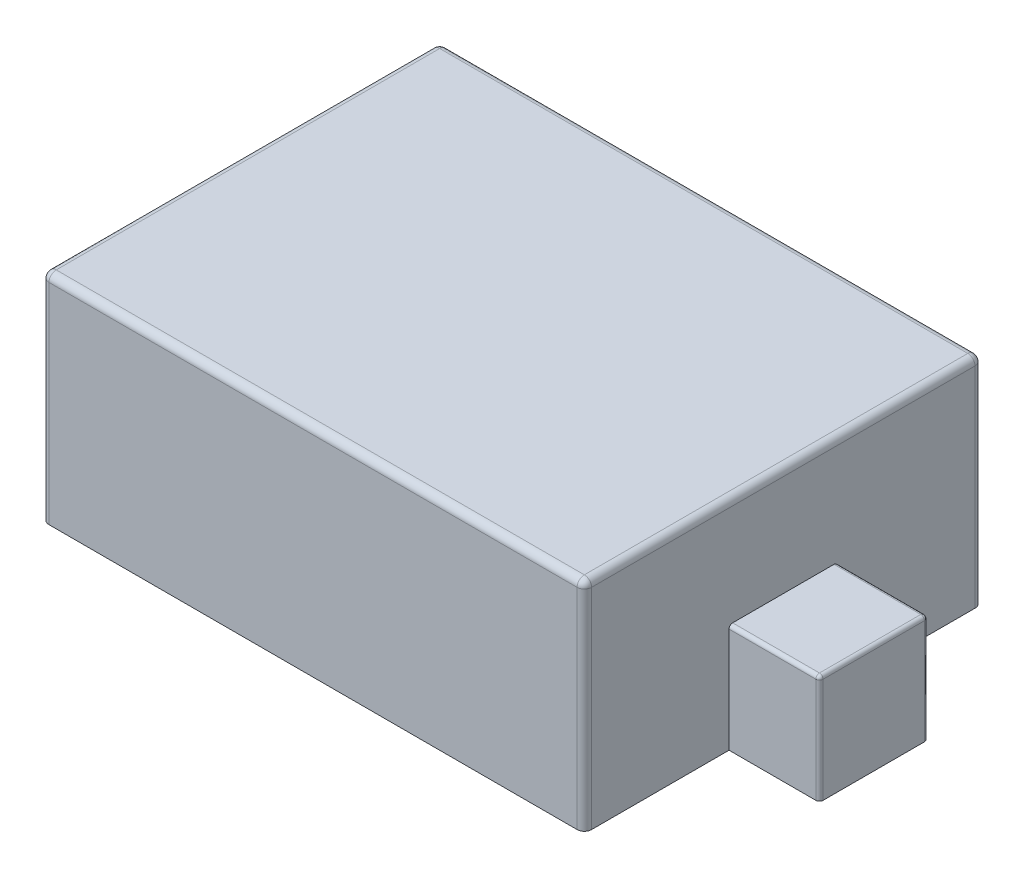
ISO-10303-21;
HEADER;
FILE_DESCRIPTION(('STEP AP214'),'2;1');
FILE_NAME('part.step','',(''),(''),'','','');
FILE_SCHEMA(('AUTOMOTIVE_DESIGN { 1 0 10303 214 1 1 1 1 }'));
ENDSEC;
DATA;
#1=APPLICATION_CONTEXT('core data for automotive mechanical design processes');
#2=APPLICATION_PROTOCOL_DEFINITION('international standard','automotive_design',2000,#1);
#3=PRODUCT_CONTEXT('',#1,'mechanical');
#4=PRODUCT('Part','Part','',(#3));
#5=PRODUCT_RELATED_PRODUCT_CATEGORY('part','',(#4));
#6=PRODUCT_DEFINITION_FORMATION('','',#4);
#7=PRODUCT_DEFINITION_CONTEXT('part definition',#1,'design');
#8=PRODUCT_DEFINITION('design','',#6,#7);
#9=PRODUCT_DEFINITION_SHAPE('','',#8);
#10=(LENGTH_UNIT() NAMED_UNIT(*) SI_UNIT(.MILLI.,.METRE.));
#11=(NAMED_UNIT(*) PLANE_ANGLE_UNIT() SI_UNIT($,.RADIAN.));
#12=(NAMED_UNIT(*) SI_UNIT($,.STERADIAN.) SOLID_ANGLE_UNIT());
#13=UNCERTAINTY_MEASURE_WITH_UNIT(LENGTH_MEASURE(1.E-05),#10,'distance_accuracy_value','');
#14=(GEOMETRIC_REPRESENTATION_CONTEXT(3) GLOBAL_UNCERTAINTY_ASSIGNED_CONTEXT((#13)) GLOBAL_UNIT_ASSIGNED_CONTEXT((#10,
#11,#12)) REPRESENTATION_CONTEXT('',''));
#15=CARTESIAN_POINT('',(0.,0.,0.));
#16=DIRECTION('',(0.,0.,1.));
#17=DIRECTION('',(1.,0.,0.));
#18=AXIS2_PLACEMENT_3D('',#15,#16,#17);
#19=CARTESIAN_POINT('',(-0.73,0.3,0.53));
#20=DIRECTION('',(0.,-1.,0.));
#21=DIRECTION('',(0.,0.,-1.));
#22=AXIS2_PLACEMENT_3D('',#19,#20,#21);
#23=CYLINDRICAL_SURFACE('',#22,0.0200000000000001);
#24=DIRECTION('',(0.,-1.,0.));
#25=VECTOR('',#24,1.);
#26=CARTESIAN_POINT('',(-0.73,0.3,0.55));
#27=LINE('',#26,#25);
#28=CARTESIAN_POINT('',(-0.73,0.28,0.55));
#29=VERTEX_POINT('',#28);
#30=CARTESIAN_POINT('',(-0.73,-0.3,0.55));
#31=VERTEX_POINT('',#30);
#32=EDGE_CURVE('E302',#29,#31,#27,.T.);
#33=ORIENTED_EDGE('',*,*,#32,.F.);
#34=CARTESIAN_POINT('',(-0.73,0.28,0.53));
#35=DIRECTION('',(0.,-1.,0.));
#36=DIRECTION('',(0.,0.,-1.));
#37=AXIS2_PLACEMENT_3D('',#34,#35,#36);
#38=CIRCLE('',#37,0.0200000000000001);
#39=CARTESIAN_POINT('',(-0.75,0.28,0.53));
#40=VERTEX_POINT('',#39);
#41=EDGE_CURVE('E304',#29,#40,#38,.T.);
#42=ORIENTED_EDGE('',*,*,#41,.T.);
#43=DIRECTION('',(0.,-1.,0.));
#44=VECTOR('',#43,1.);
#45=CARTESIAN_POINT('',(-0.75,0.3,0.53));
#46=LINE('',#45,#44);
#47=CARTESIAN_POINT('',(-0.75,-0.3,0.53));
#48=VERTEX_POINT('',#47);
#49=EDGE_CURVE('E287',#40,#48,#46,.T.);
#50=ORIENTED_EDGE('',*,*,#49,.T.);
#51=CARTESIAN_POINT('',(-0.73,-0.3,0.53));
#52=DIRECTION('',(0.,1.,0.));
#53=DIRECTION('',(0.,0.,-1.));
#54=AXIS2_PLACEMENT_3D('',#51,#52,#53);
#55=CIRCLE('',#54,0.0200000000000001);
#56=EDGE_CURVE('E267',#48,#31,#55,.T.);
#57=ORIENTED_EDGE('',*,*,#56,.T.);
#58=EDGE_LOOP('',(#33,#42,#50,#57));
#59=FACE_BOUND('',#58,.T.);
#60=ADVANCED_FACE('F33',(#59),#23,.T.);
#61=CARTESIAN_POINT('',(-0.73,0.3,0.55));
#62=DIRECTION('',(0.,0.,-1.));
#63=DIRECTION('',(-1.,0.,0.));
#64=AXIS2_PLACEMENT_3D('',#61,#62,#63);
#65=PLANE('',#64);
#66=DIRECTION('',(0.,-1.,0.));
#67=VECTOR('',#66,1.);
#68=CARTESIAN_POINT('',(0.73,0.3,0.55));
#69=LINE('',#68,#67);
#70=CARTESIAN_POINT('',(0.73,0.28,0.55));
#71=VERTEX_POINT('',#70);
#72=CARTESIAN_POINT('',(0.73,-0.3,0.55));
#73=VERTEX_POINT('',#72);
#74=EDGE_CURVE('E300',#71,#73,#69,.T.);
#75=ORIENTED_EDGE('',*,*,#74,.F.);
#76=DIRECTION('',(1.,0.,0.));
#77=VECTOR('',#76,1.);
#78=CARTESIAN_POINT('',(-0.73,0.28,0.55));
#79=LINE('',#78,#77);
#80=EDGE_CURVE('E328',#71,#29,#79,.F.);
#81=ORIENTED_EDGE('',*,*,#80,.T.);
#82=ORIENTED_EDGE('',*,*,#32,.T.);
#83=DIRECTION('',(1.,0.,0.));
#84=VECTOR('',#83,1.);
#85=CARTESIAN_POINT('',(-0.73,-0.3,0.55));
#86=LINE('',#85,#84);
#87=EDGE_CURVE('E270',#31,#73,#86,.T.);
#88=ORIENTED_EDGE('',*,*,#87,.T.);
#89=EDGE_LOOP('',(#75,#81,#82,#88));
#90=FACE_BOUND('',#89,.T.);
#91=ADVANCED_FACE('F471',(#90),#65,.F.);
#92=CARTESIAN_POINT('',(0.73,0.3,0.53));
#93=DIRECTION('',(0.,-1.,0.));
#94=DIRECTION('',(0.,0.,-1.));
#95=AXIS2_PLACEMENT_3D('',#92,#93,#94);
#96=CYLINDRICAL_SURFACE('',#95,0.0200000000000001);
#97=DIRECTION('',(0.,-1.,0.));
#98=VECTOR('',#97,1.);
#99=CARTESIAN_POINT('',(0.75,0.3,0.53));
#100=LINE('',#99,#98);
#101=CARTESIAN_POINT('',(0.75,0.28,0.53));
#102=VERTEX_POINT('',#101);
#103=CARTESIAN_POINT('',(0.75,-0.3,0.53));
#104=VERTEX_POINT('',#103);
#105=EDGE_CURVE('E298',#102,#104,#100,.T.);
#106=ORIENTED_EDGE('',*,*,#105,.F.);
#107=CARTESIAN_POINT('',(0.73,0.28,0.53));
#108=DIRECTION('',(0.,-1.,0.));
#109=DIRECTION('',(0.,0.,-1.));
#110=AXIS2_PLACEMENT_3D('',#107,#108,#109);
#111=CIRCLE('',#110,0.0200000000000001);
#112=EDGE_CURVE('E324',#102,#71,#111,.T.);
#113=ORIENTED_EDGE('',*,*,#112,.T.);
#114=ORIENTED_EDGE('',*,*,#74,.T.);
#115=CARTESIAN_POINT('',(0.73,-0.3,0.53));
#116=DIRECTION('',(0.,1.,0.));
#117=DIRECTION('',(0.,0.,1.));
#118=AXIS2_PLACEMENT_3D('',#115,#116,#117);
#119=CIRCLE('',#118,0.0200000000000001);
#120=EDGE_CURVE('E231',#73,#104,#119,.T.);
#121=ORIENTED_EDGE('',*,*,#120,.T.);
#122=EDGE_LOOP('',(#106,#113,#114,#121));
#123=FACE_BOUND('',#122,.T.);
#124=ADVANCED_FACE('F477',(#123),#96,.T.);
#125=CARTESIAN_POINT('',(0.75,0.3,0.53));
#126=DIRECTION('',(-1.,0.,0.));
#127=DIRECTION('',(0.,0.,1.));
#128=AXIS2_PLACEMENT_3D('',#125,#126,#127);
#129=PLANE('',#128);
#130=DIRECTION('',(0.,0.,-1.));
#131=VECTOR('',#130,1.);
#132=CARTESIAN_POINT('',(0.75,-0.3,0.53));
#133=LINE('',#132,#131);
#134=CARTESIAN_POINT('',(0.75,-0.3,0.15));
#135=VERTEX_POINT('',#134);
#136=EDGE_CURVE('E230',#104,#135,#133,.T.);
#137=ORIENTED_EDGE('',*,*,#136,.T.);
#138=DIRECTION('',(0.,-1.,0.));
#139=VECTOR('',#138,1.);
#140=CARTESIAN_POINT('',(0.75,0.,0.15));
#141=LINE('',#140,#139);
#142=CARTESIAN_POINT('',(0.75,-0.01,0.15));
#143=VERTEX_POINT('',#142);
#144=EDGE_CURVE('E218',#143,#135,#141,.T.);
#145=ORIENTED_EDGE('',*,*,#144,.F.);
#146=CARTESIAN_POINT('',(0.75,-0.01,0.14));
#147=DIRECTION('',(-1.,0.,0.));
#148=DIRECTION('',(0.,0.,1.));
#149=AXIS2_PLACEMENT_3D('',#146,#147,#148);
#150=CIRCLE('',#149,0.01);
#151=CARTESIAN_POINT('',(0.75,0.,0.14));
#152=VERTEX_POINT('',#151);
#153=EDGE_CURVE('E11',#143,#152,#150,.T.);
#154=ORIENTED_EDGE('',*,*,#153,.T.);
#155=DIRECTION('',(0.,0.,-1.));
#156=VECTOR('',#155,1.);
#157=CARTESIAN_POINT('',(0.75,0.,-0.15));
#158=LINE('',#157,#156);
#159=CARTESIAN_POINT('',(0.75,0.,-0.14));
#160=VERTEX_POINT('',#159);
#161=EDGE_CURVE('E219',#152,#160,#158,.T.);
#162=ORIENTED_EDGE('',*,*,#161,.T.);
#163=CARTESIAN_POINT('',(0.75,-0.01,-0.14));
#164=DIRECTION('',(-1.,0.,0.));
#165=DIRECTION('',(0.,0.,1.));
#166=AXIS2_PLACEMENT_3D('',#163,#164,#165);
#167=CIRCLE('',#166,0.01);
#168=CARTESIAN_POINT('',(0.75,-0.01,-0.15));
#169=VERTEX_POINT('',#168);
#170=EDGE_CURVE('E42',#160,#169,#167,.T.);
#171=ORIENTED_EDGE('',*,*,#170,.T.);
#172=DIRECTION('',(0.,-1.,0.));
#173=VECTOR('',#172,1.);
#174=CARTESIAN_POINT('',(0.75,0.,-0.15));
#175=LINE('',#174,#173);
#176=CARTESIAN_POINT('',(0.75,-0.3,-0.15));
#177=VERTEX_POINT('',#176);
#178=EDGE_CURVE('E206',#169,#177,#175,.T.);
#179=ORIENTED_EDGE('',*,*,#178,.T.);
#180=CARTESIAN_POINT('',(0.75,-0.3,-0.53));
#181=VERTEX_POINT('',#180);
#182=EDGE_CURVE('E211',#177,#181,#133,.T.);
#183=ORIENTED_EDGE('',*,*,#182,.T.);
#184=DIRECTION('',(0.,-1.,0.));
#185=VECTOR('',#184,1.);
#186=CARTESIAN_POINT('',(0.75,0.3,-0.53));
#187=LINE('',#186,#185);
#188=CARTESIAN_POINT('',(0.75,0.28,-0.53));
#189=VERTEX_POINT('',#188);
#190=EDGE_CURVE('E296',#189,#181,#187,.T.);
#191=ORIENTED_EDGE('',*,*,#190,.F.);
#192=DIRECTION('',(0.,0.,-1.));
#193=VECTOR('',#192,1.);
#194=CARTESIAN_POINT('',(0.75,0.28,0.53));
#195=LINE('',#194,#193);
#196=EDGE_CURVE('E326',#189,#102,#195,.F.);
#197=ORIENTED_EDGE('',*,*,#196,.T.);
#198=ORIENTED_EDGE('',*,*,#105,.T.);
#199=EDGE_LOOP('',(#137,#145,#154,#162,#171,#179,#183,#191,#197,#198));
#200=FACE_BOUND('',#199,.T.);
#201=ADVANCED_FACE('F209',(#200),#129,.F.);
#202=CARTESIAN_POINT('',(0.73,0.3,-0.53));
#203=DIRECTION('',(0.,-1.,0.));
#204=DIRECTION('',(0.,0.,-1.));
#205=AXIS2_PLACEMENT_3D('',#202,#203,#204);
#206=CYLINDRICAL_SURFACE('',#205,0.0200000000000001);
#207=DIRECTION('',(0.,-1.,0.));
#208=VECTOR('',#207,1.);
#209=CARTESIAN_POINT('',(0.73,0.3,-0.55));
#210=LINE('',#209,#208);
#211=CARTESIAN_POINT('',(0.73,0.28,-0.55));
#212=VERTEX_POINT('',#211);
#213=CARTESIAN_POINT('',(0.73,-0.3,-0.55));
#214=VERTEX_POINT('',#213);
#215=EDGE_CURVE('E294',#212,#214,#210,.T.);
#216=ORIENTED_EDGE('',*,*,#215,.F.);
#217=CARTESIAN_POINT('',(0.73,0.28,-0.53));
#218=DIRECTION('',(0.,-1.,0.));
#219=DIRECTION('',(0.,0.,-1.));
#220=AXIS2_PLACEMENT_3D('',#217,#218,#219);
#221=CIRCLE('',#220,0.0200000000000001);
#222=EDGE_CURVE('E322',#212,#189,#221,.T.);
#223=ORIENTED_EDGE('',*,*,#222,.T.);
#224=ORIENTED_EDGE('',*,*,#190,.T.);
#225=CARTESIAN_POINT('',(0.73,-0.3,-0.53));
#226=DIRECTION('',(0.,1.,0.));
#227=DIRECTION('',(0.,0.,-1.));
#228=AXIS2_PLACEMENT_3D('',#225,#226,#227);
#229=CIRCLE('',#228,0.0200000000000001);
#230=EDGE_CURVE('E229',#181,#214,#229,.T.);
#231=ORIENTED_EDGE('',*,*,#230,.T.);
#232=EDGE_LOOP('',(#216,#223,#224,#231));
#233=FACE_BOUND('',#232,.T.);
#234=ADVANCED_FACE('F592',(#233),#206,.T.);
#235=CARTESIAN_POINT('',(-0.73,0.3,-0.55));
#236=DIRECTION('',(0.,0.,1.));
#237=DIRECTION('',(1.,0.,0.));
#238=AXIS2_PLACEMENT_3D('',#235,#236,#237);
#239=PLANE('',#238);
#240=DIRECTION('',(0.,-1.,0.));
#241=VECTOR('',#240,1.);
#242=CARTESIAN_POINT('',(-0.73,0.3,-0.55));
#243=LINE('',#242,#241);
#244=CARTESIAN_POINT('',(-0.73,0.28,-0.55));
#245=VERTEX_POINT('',#244);
#246=CARTESIAN_POINT('',(-0.73,-0.3,-0.55));
#247=VERTEX_POINT('',#246);
#248=EDGE_CURVE('E292',#245,#247,#243,.T.);
#249=ORIENTED_EDGE('',*,*,#248,.F.);
#250=DIRECTION('',(-1.,0.,0.));
#251=VECTOR('',#250,1.);
#252=CARTESIAN_POINT('',(-0.73,0.28,-0.55));
#253=LINE('',#252,#251);
#254=EDGE_CURVE('E320',#245,#212,#253,.F.);
#255=ORIENTED_EDGE('',*,*,#254,.T.);
#256=ORIENTED_EDGE('',*,*,#215,.T.);
#257=DIRECTION('',(-1.,0.,0.));
#258=VECTOR('',#257,1.);
#259=CARTESIAN_POINT('',(-0.73,-0.3,-0.55));
#260=LINE('',#259,#258);
#261=EDGE_CURVE('E277',#214,#247,#260,.T.);
#262=ORIENTED_EDGE('',*,*,#261,.T.);
#263=EDGE_LOOP('',(#249,#255,#256,#262));
#264=FACE_BOUND('',#263,.T.);
#265=ADVANCED_FACE('F588',(#264),#239,.F.);
#266=CARTESIAN_POINT('',(-0.73,0.3,-0.53));
#267=DIRECTION('',(0.,-1.,0.));
#268=DIRECTION('',(0.,0.,-1.));
#269=AXIS2_PLACEMENT_3D('',#266,#267,#268);
#270=CYLINDRICAL_SURFACE('',#269,0.0200000000000001);
#271=DIRECTION('',(0.,-1.,0.));
#272=VECTOR('',#271,1.);
#273=CARTESIAN_POINT('',(-0.75,0.3,-0.53));
#274=LINE('',#273,#272);
#275=CARTESIAN_POINT('',(-0.75,0.28,-0.53));
#276=VERTEX_POINT('',#275);
#277=CARTESIAN_POINT('',(-0.75,-0.3,-0.53));
#278=VERTEX_POINT('',#277);
#279=EDGE_CURVE('E290',#276,#278,#274,.T.);
#280=ORIENTED_EDGE('',*,*,#279,.F.);
#281=CARTESIAN_POINT('',(-0.73,0.28,-0.53));
#282=DIRECTION('',(0.,-1.,0.));
#283=DIRECTION('',(0.,0.,-1.));
#284=AXIS2_PLACEMENT_3D('',#281,#282,#283);
#285=CIRCLE('',#284,0.0200000000000001);
#286=EDGE_CURVE('E318',#276,#245,#285,.T.);
#287=ORIENTED_EDGE('',*,*,#286,.T.);
#288=ORIENTED_EDGE('',*,*,#248,.T.);
#289=CARTESIAN_POINT('',(-0.73,-0.3,-0.53));
#290=DIRECTION('',(0.,1.,0.));
#291=DIRECTION('',(0.,0.,-1.));
#292=AXIS2_PLACEMENT_3D('',#289,#290,#291);
#293=CIRCLE('',#292,0.0200000000000001);
#294=EDGE_CURVE('E280',#247,#278,#293,.T.);
#295=ORIENTED_EDGE('',*,*,#294,.T.);
#296=EDGE_LOOP('',(#280,#287,#288,#295));
#297=FACE_BOUND('',#296,.T.);
#298=ADVANCED_FACE('F583',(#297),#270,.T.);
#299=CARTESIAN_POINT('',(-0.75,0.3,0.53));
#300=DIRECTION('',(1.,0.,0.));
#301=DIRECTION('',(0.,0.,-1.));
#302=AXIS2_PLACEMENT_3D('',#299,#300,#301);
#303=PLANE('',#302);
#304=DIRECTION('',(0.,0.,1.));
#305=VECTOR('',#304,1.);
#306=CARTESIAN_POINT('',(-0.75,-0.3,0.53));
#307=LINE('',#306,#305);
#308=CARTESIAN_POINT('',(-0.75,-0.3,-0.15));
#309=VERTEX_POINT('',#308);
#310=EDGE_CURVE('E284',#278,#309,#307,.T.);
#311=ORIENTED_EDGE('',*,*,#310,.T.);
#312=DIRECTION('',(0.,-1.,0.));
#313=VECTOR('',#312,1.);
#314=CARTESIAN_POINT('',(-0.75,0.,-0.15));
#315=LINE('',#314,#313);
#316=CARTESIAN_POINT('',(-0.75,-0.01,-0.15));
#317=VERTEX_POINT('',#316);
#318=EDGE_CURVE('E263',#317,#309,#315,.T.);
#319=ORIENTED_EDGE('',*,*,#318,.F.);
#320=CARTESIAN_POINT('',(-0.75,-0.01,-0.14));
#321=DIRECTION('',(1.,0.,0.));
#322=DIRECTION('',(0.,0.,-1.));
#323=AXIS2_PLACEMENT_3D('',#320,#321,#322);
#324=CIRCLE('',#323,0.01);
#325=CARTESIAN_POINT('',(-0.75,0.,-0.14));
#326=VERTEX_POINT('',#325);
#327=EDGE_CURVE('E396',#317,#326,#324,.T.);
#328=ORIENTED_EDGE('',*,*,#327,.T.);
#329=DIRECTION('',(0.,0.,1.));
#330=VECTOR('',#329,1.);
#331=CARTESIAN_POINT('',(-0.75,0.,-0.15));
#332=LINE('',#331,#330);
#333=CARTESIAN_POINT('',(-0.75,0.,0.14));
#334=VERTEX_POINT('',#333);
#335=EDGE_CURVE('E252',#326,#334,#332,.T.);
#336=ORIENTED_EDGE('',*,*,#335,.T.);
#337=CARTESIAN_POINT('',(-0.75,-0.01,0.14));
#338=DIRECTION('',(1.,0.,0.));
#339=DIRECTION('',(0.,0.,-1.));
#340=AXIS2_PLACEMENT_3D('',#337,#338,#339);
#341=CIRCLE('',#340,0.01);
#342=CARTESIAN_POINT('',(-0.75,-0.01,0.15));
#343=VERTEX_POINT('',#342);
#344=EDGE_CURVE('E398',#334,#343,#341,.T.);
#345=ORIENTED_EDGE('',*,*,#344,.T.);
#346=DIRECTION('',(0.,-1.,0.));
#347=VECTOR('',#346,1.);
#348=CARTESIAN_POINT('',(-0.75,0.,0.15));
#349=LINE('',#348,#347);
#350=CARTESIAN_POINT('',(-0.75,-0.3,0.15));
#351=VERTEX_POINT('',#350);
#352=EDGE_CURVE('E255',#343,#351,#349,.T.);
#353=ORIENTED_EDGE('',*,*,#352,.T.);
#354=EDGE_CURVE('E283',#351,#48,#307,.T.);
#355=ORIENTED_EDGE('',*,*,#354,.T.);
#356=ORIENTED_EDGE('',*,*,#49,.F.);
#357=DIRECTION('',(0.,0.,1.));
#358=VECTOR('',#357,1.);
#359=CARTESIAN_POINT('',(-0.75,0.28,0.53));
#360=LINE('',#359,#358);
#361=EDGE_CURVE('E316',#40,#276,#360,.F.);
#362=ORIENTED_EDGE('',*,*,#361,.T.);
#363=ORIENTED_EDGE('',*,*,#279,.T.);
#364=EDGE_LOOP('',(#311,#319,#328,#336,#345,#353,#355,#356,#362,#363));
#365=FACE_BOUND('',#364,.T.);
#366=ADVANCED_FACE('F552',(#365),#303,.F.);
#367=CARTESIAN_POINT('',(-0.73,0.3,0.53));
#368=DIRECTION('',(0.,-1.,0.));
#369=DIRECTION('',(0.,0.,-1.));
#370=AXIS2_PLACEMENT_3D('',#367,#368,#369);
#371=PLANE('',#370);
#372=DIRECTION('',(-1.,0.,0.));
#373=VECTOR('',#372,1.);
#374=CARTESIAN_POINT('',(-0.73,0.3,-0.53));
#375=LINE('',#374,#373);
#376=CARTESIAN_POINT('',(0.73,0.3,-0.53));
#377=VERTEX_POINT('',#376);
#378=CARTESIAN_POINT('',(-0.73,0.3,-0.53));
#379=VERTEX_POINT('',#378);
#380=EDGE_CURVE('E311',#377,#379,#375,.T.);
#381=ORIENTED_EDGE('',*,*,#380,.T.);
#382=DIRECTION('',(0.,0.,1.));
#383=VECTOR('',#382,1.);
#384=CARTESIAN_POINT('',(-0.73,0.3,0.53));
#385=LINE('',#384,#383);
#386=CARTESIAN_POINT('',(-0.73,0.3,0.53));
#387=VERTEX_POINT('',#386);
#388=EDGE_CURVE('E313',#379,#387,#385,.T.);
#389=ORIENTED_EDGE('',*,*,#388,.T.);
#390=DIRECTION('',(1.,0.,0.));
#391=VECTOR('',#390,1.);
#392=CARTESIAN_POINT('',(-0.73,0.3,0.53));
#393=LINE('',#392,#391);
#394=CARTESIAN_POINT('',(0.73,0.3,0.53));
#395=VERTEX_POINT('',#394);
#396=EDGE_CURVE('E307',#387,#395,#393,.T.);
#397=ORIENTED_EDGE('',*,*,#396,.T.);
#398=DIRECTION('',(0.,0.,-1.));
#399=VECTOR('',#398,1.);
#400=CARTESIAN_POINT('',(0.73,0.3,0.53));
#401=LINE('',#400,#399);
#402=EDGE_CURVE('E309',#395,#377,#401,.T.);
#403=ORIENTED_EDGE('',*,*,#402,.T.);
#404=EDGE_LOOP('',(#381,#389,#397,#403));
#405=FACE_BOUND('',#404,.T.);
#406=ADVANCED_FACE('F616',(#405),#371,.F.);
#407=CARTESIAN_POINT('',(-0.73,-0.3,0.53));
#408=DIRECTION('',(0.,-1.,0.));
#409=DIRECTION('',(0.,0.,-1.));
#410=AXIS2_PLACEMENT_3D('',#407,#408,#409);
#411=PLANE('',#410);
#412=DIRECTION('',(0.,0.,-1.));
#413=VECTOR('',#412,1.);
#414=CARTESIAN_POINT('',(-1.,-0.3,-0.15));
#415=LINE('',#414,#413);
#416=CARTESIAN_POINT('',(-1.,-0.3,0.14));
#417=VERTEX_POINT('',#416);
#418=CARTESIAN_POINT('',(-1.,-0.3,-0.14));
#419=VERTEX_POINT('',#418);
#420=EDGE_CURVE('E259',#417,#419,#415,.T.);
#421=ORIENTED_EDGE('',*,*,#420,.T.);
#422=CARTESIAN_POINT('',(-0.99,-0.3,-0.14));
#423=DIRECTION('',(0.,-1.,0.));
#424=DIRECTION('',(0.,0.,-1.));
#425=AXIS2_PLACEMENT_3D('',#422,#423,#424);
#426=CIRCLE('',#425,0.01);
#427=CARTESIAN_POINT('',(-0.99,-0.3,-0.15));
#428=VERTEX_POINT('',#427);
#429=EDGE_CURVE('E363',#419,#428,#426,.T.);
#430=ORIENTED_EDGE('',*,*,#429,.T.);
#431=DIRECTION('',(1.,0.,0.));
#432=VECTOR('',#431,1.);
#433=CARTESIAN_POINT('',(-0.75,-0.3,-0.15));
#434=LINE('',#433,#432);
#435=EDGE_CURVE('E256',#428,#309,#434,.T.);
#436=ORIENTED_EDGE('',*,*,#435,.T.);
#437=ORIENTED_EDGE('',*,*,#310,.F.);
#438=ORIENTED_EDGE('',*,*,#294,.F.);
#439=ORIENTED_EDGE('',*,*,#261,.F.);
#440=ORIENTED_EDGE('',*,*,#230,.F.);
#441=ORIENTED_EDGE('',*,*,#182,.F.);
#442=DIRECTION('',(1.,0.,0.));
#443=VECTOR('',#442,1.);
#444=CARTESIAN_POINT('',(0.75,-0.3,-0.15));
#445=LINE('',#444,#443);
#446=CARTESIAN_POINT('',(0.99,-0.3,-0.15));
#447=VERTEX_POINT('',#446);
#448=EDGE_CURVE('E226',#177,#447,#445,.T.);
#449=ORIENTED_EDGE('',*,*,#448,.T.);
#450=CARTESIAN_POINT('',(0.99,-0.3,-0.14));
#451=DIRECTION('',(0.,-1.,0.));
#452=DIRECTION('',(0.,0.,-1.));
#453=AXIS2_PLACEMENT_3D('',#450,#451,#452);
#454=CIRCLE('',#453,0.01);
#455=CARTESIAN_POINT('',(1.,-0.3,-0.14));
#456=VERTEX_POINT('',#455);
#457=EDGE_CURVE('E359',#447,#456,#454,.T.);
#458=ORIENTED_EDGE('',*,*,#457,.T.);
#459=DIRECTION('',(0.,0.,1.));
#460=VECTOR('',#459,1.);
#461=CARTESIAN_POINT('',(1.,-0.3,-0.15));
#462=LINE('',#461,#460);
#463=CARTESIAN_POINT('',(1.,-0.3,0.14));
#464=VERTEX_POINT('',#463);
#465=EDGE_CURVE('E237',#456,#464,#462,.T.);
#466=ORIENTED_EDGE('',*,*,#465,.T.);
#467=CARTESIAN_POINT('',(0.99,-0.3,0.14));
#468=DIRECTION('',(0.,-1.,0.));
#469=DIRECTION('',(0.,0.,-1.));
#470=AXIS2_PLACEMENT_3D('',#467,#468,#469);
#471=CIRCLE('',#470,0.01);
#472=CARTESIAN_POINT('',(0.99,-0.3,0.15));
#473=VERTEX_POINT('',#472);
#474=EDGE_CURVE('E357',#464,#473,#471,.T.);
#475=ORIENTED_EDGE('',*,*,#474,.T.);
#476=DIRECTION('',(-1.,0.,0.));
#477=VECTOR('',#476,1.);
#478=CARTESIAN_POINT('',(0.75,-0.3,0.15));
#479=LINE('',#478,#477);
#480=EDGE_CURVE('E241',#473,#135,#479,.T.);
#481=ORIENTED_EDGE('',*,*,#480,.T.);
#482=ORIENTED_EDGE('',*,*,#136,.F.);
#483=ORIENTED_EDGE('',*,*,#120,.F.);
#484=ORIENTED_EDGE('',*,*,#87,.F.);
#485=ORIENTED_EDGE('',*,*,#56,.F.);
#486=ORIENTED_EDGE('',*,*,#354,.F.);
#487=DIRECTION('',(-1.,0.,0.));
#488=VECTOR('',#487,1.);
#489=CARTESIAN_POINT('',(-0.75,-0.3,0.15));
#490=LINE('',#489,#488);
#491=CARTESIAN_POINT('',(-0.99,-0.3,0.15));
#492=VERTEX_POINT('',#491);
#493=EDGE_CURVE('E250',#351,#492,#490,.T.);
#494=ORIENTED_EDGE('',*,*,#493,.T.);
#495=CARTESIAN_POINT('',(-0.99,-0.3,0.14));
#496=DIRECTION('',(0.,-1.,0.));
#497=DIRECTION('',(0.,0.,-1.));
#498=AXIS2_PLACEMENT_3D('',#495,#496,#497);
#499=CIRCLE('',#498,0.01);
#500=EDGE_CURVE('E361',#492,#417,#499,.T.);
#501=ORIENTED_EDGE('',*,*,#500,.T.);
#502=EDGE_LOOP('',(#421,#430,#436,#437,#438,#439,#440,#441,#449,#458,#466,#475,#481,#482,#483,
#484,#485,#486,#494,#501));
#503=FACE_BOUND('',#502,.T.);
#504=ADVANCED_FACE('F225',(#503),#411,.T.);
#505=CARTESIAN_POINT('',(0.73,0.28,-0.53));
#506=DIRECTION('',(0.,-1.,0.));
#507=DIRECTION('',(0.,0.,-1.));
#508=AXIS2_PLACEMENT_3D('',#505,#506,#507);
#509=SPHERICAL_SURFACE('',#508,0.02);
#510=CARTESIAN_POINT('',(0.73,0.28,-0.53));
#511=DIRECTION('',(0.,0.,1.));
#512=DIRECTION('',(1.,0.,0.));
#513=AXIS2_PLACEMENT_3D('',#510,#511,#512);
#514=CIRCLE('',#513,0.02);
#515=EDGE_CURVE('E346',#189,#377,#514,.T.);
#516=ORIENTED_EDGE('',*,*,#515,.F.);
#517=ORIENTED_EDGE('',*,*,#222,.F.);
#518=CARTESIAN_POINT('',(0.73,0.28,-0.53));
#519=DIRECTION('',(-1.,0.,0.));
#520=DIRECTION('',(0.,0.,1.));
#521=AXIS2_PLACEMENT_3D('',#518,#519,#520);
#522=CIRCLE('',#521,0.02);
#523=EDGE_CURVE('E271',#377,#212,#522,.T.);
#524=ORIENTED_EDGE('',*,*,#523,.F.);
#525=EDGE_LOOP('',(#516,#517,#524));
#526=FACE_BOUND('',#525,.T.);
#527=ADVANCED_FACE('F511',(#526),#509,.T.);
#528=CARTESIAN_POINT('',(-0.73,0.28,-0.53));
#529=DIRECTION('',(-1.,0.,0.));
#530=DIRECTION('',(0.,0.,1.));
#531=AXIS2_PLACEMENT_3D('',#528,#529,#530);
#532=CYLINDRICAL_SURFACE('',#531,0.02);
#533=ORIENTED_EDGE('',*,*,#523,.T.);
#534=ORIENTED_EDGE('',*,*,#254,.F.);
#535=CARTESIAN_POINT('',(-0.73,0.28,-0.53));
#536=DIRECTION('',(-1.,0.,0.));
#537=DIRECTION('',(0.,0.,1.));
#538=AXIS2_PLACEMENT_3D('',#535,#536,#537);
#539=CIRCLE('',#538,0.02);
#540=EDGE_CURVE('E343',#379,#245,#539,.T.);
#541=ORIENTED_EDGE('',*,*,#540,.F.);
#542=ORIENTED_EDGE('',*,*,#380,.F.);
#543=EDGE_LOOP('',(#533,#534,#541,#542));
#544=FACE_BOUND('',#543,.T.);
#545=ADVANCED_FACE('F507',(#544),#532,.T.);
#546=CARTESIAN_POINT('',(0.73,0.28,0.53));
#547=DIRECTION('',(0.,0.,-1.));
#548=DIRECTION('',(-1.,0.,0.));
#549=AXIS2_PLACEMENT_3D('',#546,#547,#548);
#550=CYLINDRICAL_SURFACE('',#549,0.02);
#551=ORIENTED_EDGE('',*,*,#515,.T.);
#552=ORIENTED_EDGE('',*,*,#402,.F.);
#553=CARTESIAN_POINT('',(0.73,0.28,0.53));
#554=DIRECTION('',(0.,0.,1.));
#555=DIRECTION('',(0.,-1.,0.));
#556=AXIS2_PLACEMENT_3D('',#553,#554,#555);
#557=CIRCLE('',#556,0.02);
#558=EDGE_CURVE('E340',#102,#395,#557,.T.);
#559=ORIENTED_EDGE('',*,*,#558,.F.);
#560=ORIENTED_EDGE('',*,*,#196,.F.);
#561=EDGE_LOOP('',(#551,#552,#559,#560));
#562=FACE_BOUND('',#561,.T.);
#563=ADVANCED_FACE('F503',(#562),#550,.T.);
#564=CARTESIAN_POINT('',(-0.73,0.28,-0.53));
#565=DIRECTION('',(0.,-1.,0.));
#566=DIRECTION('',(0.,0.,-1.));
#567=AXIS2_PLACEMENT_3D('',#564,#565,#566);
#568=SPHERICAL_SURFACE('',#567,0.02);
#569=ORIENTED_EDGE('',*,*,#540,.T.);
#570=ORIENTED_EDGE('',*,*,#286,.F.);
#571=CARTESIAN_POINT('',(-0.73,0.28,-0.53));
#572=DIRECTION('',(0.,0.,1.));
#573=DIRECTION('',(1.,0.,0.));
#574=AXIS2_PLACEMENT_3D('',#571,#572,#573);
#575=CIRCLE('',#574,0.02);
#576=EDGE_CURVE('E337',#379,#276,#575,.T.);
#577=ORIENTED_EDGE('',*,*,#576,.F.);
#578=EDGE_LOOP('',(#569,#570,#577));
#579=FACE_BOUND('',#578,.T.);
#580=ADVANCED_FACE('F499',(#579),#568,.T.);
#581=CARTESIAN_POINT('',(0.73,0.28,0.53));
#582=DIRECTION('',(0.,-1.,0.));
#583=DIRECTION('',(0.,0.,-1.));
#584=AXIS2_PLACEMENT_3D('',#581,#582,#583);
#585=SPHERICAL_SURFACE('',#584,0.02);
#586=ORIENTED_EDGE('',*,*,#112,.F.);
#587=ORIENTED_EDGE('',*,*,#558,.T.);
#588=CARTESIAN_POINT('',(0.73,0.28,0.53));
#589=DIRECTION('',(-1.,0.,0.));
#590=DIRECTION('',(0.,0.,1.));
#591=AXIS2_PLACEMENT_3D('',#588,#589,#590);
#592=CIRCLE('',#591,0.02);
#593=EDGE_CURVE('E334',#71,#395,#592,.T.);
#594=ORIENTED_EDGE('',*,*,#593,.F.);
#595=EDGE_LOOP('',(#586,#587,#594));
#596=FACE_BOUND('',#595,.T.);
#597=ADVANCED_FACE('F495',(#596),#585,.T.);
#598=CARTESIAN_POINT('',(-0.73,0.28,0.53));
#599=DIRECTION('',(0.,0.,1.));
#600=DIRECTION('',(1.,0.,0.));
#601=AXIS2_PLACEMENT_3D('',#598,#599,#600);
#602=CYLINDRICAL_SURFACE('',#601,0.02);
#603=ORIENTED_EDGE('',*,*,#576,.T.);
#604=ORIENTED_EDGE('',*,*,#361,.F.);
#605=CARTESIAN_POINT('',(-0.73,0.28,0.53));
#606=DIRECTION('',(0.,0.,1.));
#607=DIRECTION('',(1.,0.,0.));
#608=AXIS2_PLACEMENT_3D('',#605,#606,#607);
#609=CIRCLE('',#608,0.02);
#610=EDGE_CURVE('E332',#387,#40,#609,.T.);
#611=ORIENTED_EDGE('',*,*,#610,.F.);
#612=ORIENTED_EDGE('',*,*,#388,.F.);
#613=EDGE_LOOP('',(#603,#604,#611,#612));
#614=FACE_BOUND('',#613,.T.);
#615=ADVANCED_FACE('F491',(#614),#602,.T.);
#616=CARTESIAN_POINT('',(-0.73,0.28,0.53));
#617=DIRECTION('',(1.,0.,0.));
#618=DIRECTION('',(0.,0.,-1.));
#619=AXIS2_PLACEMENT_3D('',#616,#617,#618);
#620=CYLINDRICAL_SURFACE('',#619,0.02);
#621=ORIENTED_EDGE('',*,*,#593,.T.);
#622=ORIENTED_EDGE('',*,*,#396,.F.);
#623=CARTESIAN_POINT('',(-0.73,0.28,0.53));
#624=DIRECTION('',(-1.,0.,0.));
#625=DIRECTION('',(0.,-1.,0.));
#626=AXIS2_PLACEMENT_3D('',#623,#624,#625);
#627=CIRCLE('',#626,0.02);
#628=EDGE_CURVE('E265',#29,#387,#627,.T.);
#629=ORIENTED_EDGE('',*,*,#628,.F.);
#630=ORIENTED_EDGE('',*,*,#80,.F.);
#631=EDGE_LOOP('',(#621,#622,#629,#630));
#632=FACE_BOUND('',#631,.T.);
#633=ADVANCED_FACE('F487',(#632),#620,.T.);
#634=CARTESIAN_POINT('',(-0.73,0.28,0.53));
#635=DIRECTION('',(0.,-1.,0.));
#636=DIRECTION('',(0.,0.,-1.));
#637=AXIS2_PLACEMENT_3D('',#634,#635,#636);
#638=SPHERICAL_SURFACE('',#637,0.02);
#639=ORIENTED_EDGE('',*,*,#610,.T.);
#640=ORIENTED_EDGE('',*,*,#41,.F.);
#641=ORIENTED_EDGE('',*,*,#628,.T.);
#642=EDGE_LOOP('',(#639,#640,#641));
#643=FACE_BOUND('',#642,.T.);
#644=ADVANCED_FACE('F483',(#643),#638,.T.);
#645=CARTESIAN_POINT('',(-0.75,0.,-0.15));
#646=DIRECTION('',(0.,0.,-1.));
#647=DIRECTION('',(-1.,0.,0.));
#648=AXIS2_PLACEMENT_3D('',#645,#646,#647);
#649=PLANE('',#648);
#650=ORIENTED_EDGE('',*,*,#435,.F.);
#651=DIRECTION('',(0.,-1.,0.));
#652=VECTOR('',#651,1.);
#653=CARTESIAN_POINT('',(-0.99,0.,-0.15));
#654=LINE('',#653,#652);
#655=CARTESIAN_POINT('',(-0.99,-0.01,-0.15));
#656=VERTEX_POINT('',#655);
#657=EDGE_CURVE('E367',#428,#656,#654,.F.);
#658=ORIENTED_EDGE('',*,*,#657,.T.);
#659=DIRECTION('',(1.,0.,0.));
#660=VECTOR('',#659,1.);
#661=CARTESIAN_POINT('',(-0.75,-0.01,-0.15));
#662=LINE('',#661,#660);
#663=EDGE_CURVE('E365',#656,#317,#662,.T.);
#664=ORIENTED_EDGE('',*,*,#663,.T.);
#665=ORIENTED_EDGE('',*,*,#318,.T.);
#666=EDGE_LOOP('',(#650,#658,#664,#665));
#667=FACE_BOUND('',#666,.T.);
#668=ADVANCED_FACE('F486',(#667),#649,.T.);
#669=CARTESIAN_POINT('',(-1.,0.,-0.15));
#670=DIRECTION('',(-1.,0.,0.));
#671=DIRECTION('',(0.,0.,1.));
#672=AXIS2_PLACEMENT_3D('',#669,#670,#671);
#673=PLANE('',#672);
#674=DIRECTION('',(0.,0.,-1.));
#675=VECTOR('',#674,1.);
#676=CARTESIAN_POINT('',(-1.,-0.01,-0.15));
#677=LINE('',#676,#675);
#678=CARTESIAN_POINT('',(-1.,-0.01,0.14));
#679=VERTEX_POINT('',#678);
#680=CARTESIAN_POINT('',(-1.,-0.01,-0.14));
#681=VERTEX_POINT('',#680);
#682=EDGE_CURVE('E352',#679,#681,#677,.T.);
#683=ORIENTED_EDGE('',*,*,#682,.T.);
#684=DIRECTION('',(0.,-1.,0.));
#685=VECTOR('',#684,1.);
#686=CARTESIAN_POINT('',(-1.,0.,-0.14));
#687=LINE('',#686,#685);
#688=EDGE_CURVE('E354',#681,#419,#687,.T.);
#689=ORIENTED_EDGE('',*,*,#688,.T.);
#690=ORIENTED_EDGE('',*,*,#420,.F.);
#691=DIRECTION('',(0.,-1.,0.));
#692=VECTOR('',#691,1.);
#693=CARTESIAN_POINT('',(-1.,0.,0.14));
#694=LINE('',#693,#692);
#695=EDGE_CURVE('E330',#417,#679,#694,.F.);
#696=ORIENTED_EDGE('',*,*,#695,.T.);
#697=EDGE_LOOP('',(#683,#689,#690,#696));
#698=FACE_BOUND('',#697,.T.);
#699=ADVANCED_FACE('F566',(#698),#673,.T.);
#700=CARTESIAN_POINT('',(-0.75,0.,0.15));
#701=DIRECTION('',(0.,0.,1.));
#702=DIRECTION('',(1.,0.,0.));
#703=AXIS2_PLACEMENT_3D('',#700,#701,#702);
#704=PLANE('',#703);
#705=ORIENTED_EDGE('',*,*,#352,.F.);
#706=DIRECTION('',(-1.,0.,0.));
#707=VECTOR('',#706,1.);
#708=CARTESIAN_POINT('',(-1.,-0.01,0.15));
#709=LINE('',#708,#707);
#710=CARTESIAN_POINT('',(-0.99,-0.01,0.15));
#711=VERTEX_POINT('',#710);
#712=EDGE_CURVE('E377',#343,#711,#709,.T.);
#713=ORIENTED_EDGE('',*,*,#712,.T.);
#714=DIRECTION('',(0.,-1.,0.));
#715=VECTOR('',#714,1.);
#716=CARTESIAN_POINT('',(-0.99,0.,0.15));
#717=LINE('',#716,#715);
#718=EDGE_CURVE('E375',#711,#492,#717,.T.);
#719=ORIENTED_EDGE('',*,*,#718,.T.);
#720=ORIENTED_EDGE('',*,*,#493,.F.);
#721=EDGE_LOOP('',(#705,#713,#719,#720));
#722=FACE_BOUND('',#721,.T.);
#723=ADVANCED_FACE('F557',(#722),#704,.T.);
#724=CARTESIAN_POINT('',(0.,0.,0.));
#725=DIRECTION('',(0.,-1.,0.));
#726=DIRECTION('',(0.,0.,-1.));
#727=AXIS2_PLACEMENT_3D('',#724,#725,#726);
#728=PLANE('',#727);
#729=ORIENTED_EDGE('',*,*,#335,.F.);
#730=DIRECTION('',(1.,0.,0.));
#731=VECTOR('',#730,1.);
#732=CARTESIAN_POINT('',(-1.,0.,-0.14));
#733=LINE('',#732,#731);
#734=CARTESIAN_POINT('',(-0.99,0.,-0.14));
#735=VERTEX_POINT('',#734);
#736=EDGE_CURVE('E373',#326,#735,#733,.F.);
#737=ORIENTED_EDGE('',*,*,#736,.T.);
#738=DIRECTION('',(0.,0.,-1.));
#739=VECTOR('',#738,1.);
#740=CARTESIAN_POINT('',(-0.99,0.,0.15));
#741=LINE('',#740,#739);
#742=CARTESIAN_POINT('',(-0.99,0.,0.14));
#743=VERTEX_POINT('',#742);
#744=EDGE_CURVE('E371',#735,#743,#741,.F.);
#745=ORIENTED_EDGE('',*,*,#744,.T.);
#746=DIRECTION('',(-1.,0.,0.));
#747=VECTOR('',#746,1.);
#748=CARTESIAN_POINT('',(-0.75,0.,0.14));
#749=LINE('',#748,#747);
#750=EDGE_CURVE('E369',#743,#334,#749,.F.);
#751=ORIENTED_EDGE('',*,*,#750,.T.);
#752=EDGE_LOOP('',(#729,#737,#745,#751));
#753=FACE_BOUND('',#752,.T.);
#754=ADVANCED_FACE('F694',(#753),#728,.F.);
#755=CARTESIAN_POINT('',(0.75,0.,0.15));
#756=DIRECTION('',(0.,0.,1.));
#757=DIRECTION('',(1.,0.,0.));
#758=AXIS2_PLACEMENT_3D('',#755,#756,#757);
#759=PLANE('',#758);
#760=ORIENTED_EDGE('',*,*,#480,.F.);
#761=DIRECTION('',(0.,-1.,0.));
#762=VECTOR('',#761,1.);
#763=CARTESIAN_POINT('',(0.99,0.,0.15));
#764=LINE('',#763,#762);
#765=CARTESIAN_POINT('',(0.99,-0.01,0.15));
#766=VERTEX_POINT('',#765);
#767=EDGE_CURVE('E390',#473,#766,#764,.F.);
#768=ORIENTED_EDGE('',*,*,#767,.T.);
#769=DIRECTION('',(-1.,0.,0.));
#770=VECTOR('',#769,1.);
#771=CARTESIAN_POINT('',(0.75,-0.01,0.15));
#772=LINE('',#771,#770);
#773=EDGE_CURVE('E388',#766,#143,#772,.T.);
#774=ORIENTED_EDGE('',*,*,#773,.T.);
#775=ORIENTED_EDGE('',*,*,#144,.T.);
#776=EDGE_LOOP('',(#760,#768,#774,#775));
#777=FACE_BOUND('',#776,.T.);
#778=ADVANCED_FACE('F454',(#777),#759,.T.);
#779=CARTESIAN_POINT('',(1.,0.,-0.15));
#780=DIRECTION('',(1.,0.,0.));
#781=DIRECTION('',(0.,0.,-1.));
#782=AXIS2_PLACEMENT_3D('',#779,#780,#781);
#783=PLANE('',#782);
#784=ORIENTED_EDGE('',*,*,#465,.F.);
#785=DIRECTION('',(0.,-1.,0.));
#786=VECTOR('',#785,1.);
#787=CARTESIAN_POINT('',(1.,0.,-0.14));
#788=LINE('',#787,#786);
#789=CARTESIAN_POINT('',(1.,-0.01,-0.14));
#790=VERTEX_POINT('',#789);
#791=EDGE_CURVE('E386',#456,#790,#788,.F.);
#792=ORIENTED_EDGE('',*,*,#791,.T.);
#793=DIRECTION('',(0.,0.,1.));
#794=VECTOR('',#793,1.);
#795=CARTESIAN_POINT('',(1.,-0.01,-0.15));
#796=LINE('',#795,#794);
#797=CARTESIAN_POINT('',(1.,-0.01,0.14));
#798=VERTEX_POINT('',#797);
#799=EDGE_CURVE('E382',#790,#798,#796,.T.);
#800=ORIENTED_EDGE('',*,*,#799,.T.);
#801=DIRECTION('',(0.,-1.,0.));
#802=VECTOR('',#801,1.);
#803=CARTESIAN_POINT('',(1.,0.,0.14));
#804=LINE('',#803,#802);
#805=EDGE_CURVE('E384',#798,#464,#804,.T.);
#806=ORIENTED_EDGE('',*,*,#805,.T.);
#807=EDGE_LOOP('',(#784,#792,#800,#806));
#808=FACE_BOUND('',#807,.T.);
#809=ADVANCED_FACE('F460',(#808),#783,.T.);
#810=CARTESIAN_POINT('',(0.75,0.,-0.15));
#811=DIRECTION('',(0.,0.,-1.));
#812=DIRECTION('',(-1.,0.,0.));
#813=AXIS2_PLACEMENT_3D('',#810,#811,#812);
#814=PLANE('',#813);
#815=DIRECTION('',(1.,0.,0.));
#816=VECTOR('',#815,1.);
#817=CARTESIAN_POINT('',(0.75,-0.01,-0.15));
#818=LINE('',#817,#816);
#819=CARTESIAN_POINT('',(0.99,-0.01,-0.15));
#820=VERTEX_POINT('',#819);
#821=EDGE_CURVE('E379',#169,#820,#818,.T.);
#822=ORIENTED_EDGE('',*,*,#821,.T.);
#823=DIRECTION('',(0.,-1.,0.));
#824=VECTOR('',#823,1.);
#825=CARTESIAN_POINT('',(0.99,0.,-0.15));
#826=LINE('',#825,#824);
#827=EDGE_CURVE('E236',#820,#447,#826,.T.);
#828=ORIENTED_EDGE('',*,*,#827,.T.);
#829=ORIENTED_EDGE('',*,*,#448,.F.);
#830=ORIENTED_EDGE('',*,*,#178,.F.);
#831=EDGE_LOOP('',(#822,#828,#829,#830));
#832=FACE_BOUND('',#831,.T.);
#833=ADVANCED_FACE('F234',(#832),#814,.T.);
#834=CARTESIAN_POINT('',(0.,0.,0.));
#835=DIRECTION('',(0.,1.,0.));
#836=DIRECTION('',(0.,0.,1.));
#837=AXIS2_PLACEMENT_3D('',#834,#835,#836);
#838=PLANE('',#837);
#839=DIRECTION('',(0.,0.,1.));
#840=VECTOR('',#839,1.);
#841=CARTESIAN_POINT('',(0.99,0.,0.));
#842=LINE('',#841,#840);
#843=CARTESIAN_POINT('',(0.99,0.,0.14));
#844=VERTEX_POINT('',#843);
#845=CARTESIAN_POINT('',(0.99,0.,-0.14));
#846=VERTEX_POINT('',#845);
#847=EDGE_CURVE('E50',#844,#846,#842,.F.);
#848=ORIENTED_EDGE('',*,*,#847,.T.);
#849=DIRECTION('',(1.,0.,0.));
#850=VECTOR('',#849,1.);
#851=CARTESIAN_POINT('',(0.,0.,-0.14));
#852=LINE('',#851,#850);
#853=EDGE_CURVE('E394',#846,#160,#852,.F.);
#854=ORIENTED_EDGE('',*,*,#853,.T.);
#855=ORIENTED_EDGE('',*,*,#161,.F.);
#856=DIRECTION('',(-1.,0.,0.));
#857=VECTOR('',#856,1.);
#858=CARTESIAN_POINT('',(0.,0.,0.14));
#859=LINE('',#858,#857);
#860=EDGE_CURVE('E55',#152,#844,#859,.F.);
#861=ORIENTED_EDGE('',*,*,#860,.T.);
#862=EDGE_LOOP('',(#848,#854,#855,#861));
#863=FACE_BOUND('',#862,.T.);
#864=ADVANCED_FACE('F446',(#863),#838,.T.);
#865=CARTESIAN_POINT('',(-0.75,-0.01,0.14));
#866=DIRECTION('',(1.,0.,0.));
#867=DIRECTION('',(0.,0.,-1.));
#868=AXIS2_PLACEMENT_3D('',#865,#866,#867);
#869=CYLINDRICAL_SURFACE('',#868,0.01);
#870=ORIENTED_EDGE('',*,*,#344,.F.);
#871=ORIENTED_EDGE('',*,*,#750,.F.);
#872=CARTESIAN_POINT('',(-0.99,-0.01,0.14));
#873=DIRECTION('',(-1.,0.,0.));
#874=DIRECTION('',(0.,0.,1.));
#875=AXIS2_PLACEMENT_3D('',#872,#873,#874);
#876=CIRCLE('',#875,0.01);
#877=EDGE_CURVE('E238',#711,#743,#876,.T.);
#878=ORIENTED_EDGE('',*,*,#877,.F.);
#879=ORIENTED_EDGE('',*,*,#712,.F.);
#880=EDGE_LOOP('',(#870,#871,#878,#879));
#881=FACE_BOUND('',#880,.T.);
#882=ADVANCED_FACE('F538',(#881),#869,.T.);
#883=CARTESIAN_POINT('',(-0.99,0.,0.14));
#884=DIRECTION('',(0.,-1.,0.));
#885=DIRECTION('',(0.,0.,-1.));
#886=AXIS2_PLACEMENT_3D('',#883,#884,#885);
#887=CYLINDRICAL_SURFACE('',#886,0.01);
#888=ORIENTED_EDGE('',*,*,#500,.F.);
#889=ORIENTED_EDGE('',*,*,#718,.F.);
#890=CARTESIAN_POINT('',(-0.99,-0.01,0.14));
#891=DIRECTION('',(0.,1.,0.));
#892=DIRECTION('',(0.,0.,1.));
#893=AXIS2_PLACEMENT_3D('',#890,#891,#892);
#894=CIRCLE('',#893,0.01);
#895=EDGE_CURVE('E244',#679,#711,#894,.T.);
#896=ORIENTED_EDGE('',*,*,#895,.F.);
#897=ORIENTED_EDGE('',*,*,#695,.F.);
#898=EDGE_LOOP('',(#888,#889,#896,#897));
#899=FACE_BOUND('',#898,.T.);
#900=ADVANCED_FACE('F535',(#899),#887,.T.);
#901=CARTESIAN_POINT('',(-0.99,-0.01,0.14));
#902=DIRECTION('',(0.,0.,1.));
#903=DIRECTION('',(1.,0.,0.));
#904=AXIS2_PLACEMENT_3D('',#901,#902,#903);
#905=SPHERICAL_SURFACE('',#904,0.01);
#906=ORIENTED_EDGE('',*,*,#895,.T.);
#907=ORIENTED_EDGE('',*,*,#877,.T.);
#908=CARTESIAN_POINT('',(-0.99,-0.01,0.14));
#909=DIRECTION('',(0.,0.,1.));
#910=DIRECTION('',(1.,0.,0.));
#911=AXIS2_PLACEMENT_3D('',#908,#909,#910);
#912=CIRCLE('',#911,0.01);
#913=EDGE_CURVE('E410',#679,#743,#912,.F.);
#914=ORIENTED_EDGE('',*,*,#913,.F.);
#915=EDGE_LOOP('',(#906,#907,#914));
#916=FACE_BOUND('',#915,.T.);
#917=ADVANCED_FACE('F531',(#916),#905,.T.);
#918=CARTESIAN_POINT('',(-0.75,-0.01,-0.14));
#919=DIRECTION('',(-1.,0.,0.));
#920=DIRECTION('',(0.,0.,1.));
#921=AXIS2_PLACEMENT_3D('',#918,#919,#920);
#922=CYLINDRICAL_SURFACE('',#921,0.01);
#923=ORIENTED_EDGE('',*,*,#327,.F.);
#924=ORIENTED_EDGE('',*,*,#663,.F.);
#925=CARTESIAN_POINT('',(-0.99,-0.01,-0.14));
#926=DIRECTION('',(-1.,0.,0.));
#927=DIRECTION('',(0.,0.,1.));
#928=AXIS2_PLACEMENT_3D('',#925,#926,#927);
#929=CIRCLE('',#928,0.01);
#930=EDGE_CURVE('E407',#735,#656,#929,.T.);
#931=ORIENTED_EDGE('',*,*,#930,.F.);
#932=ORIENTED_EDGE('',*,*,#736,.F.);
#933=EDGE_LOOP('',(#923,#924,#931,#932));
#934=FACE_BOUND('',#933,.T.);
#935=ADVANCED_FACE('F527',(#934),#922,.T.);
#936=CARTESIAN_POINT('',(-0.99,-0.01,-0.15));
#937=DIRECTION('',(0.,0.,1.));
#938=DIRECTION('',(1.,0.,0.));
#939=AXIS2_PLACEMENT_3D('',#936,#937,#938);
#940=CYLINDRICAL_SURFACE('',#939,0.01);
#941=ORIENTED_EDGE('',*,*,#913,.T.);
#942=ORIENTED_EDGE('',*,*,#744,.F.);
#943=CARTESIAN_POINT('',(-0.99,-0.01,-0.14));
#944=DIRECTION('',(0.,0.,-1.));
#945=DIRECTION('',(-1.,0.,0.));
#946=AXIS2_PLACEMENT_3D('',#943,#944,#945);
#947=CIRCLE('',#946,0.01);
#948=EDGE_CURVE('E404',#681,#735,#947,.T.);
#949=ORIENTED_EDGE('',*,*,#948,.F.);
#950=ORIENTED_EDGE('',*,*,#682,.F.);
#951=EDGE_LOOP('',(#941,#942,#949,#950));
#952=FACE_BOUND('',#951,.T.);
#953=ADVANCED_FACE('F523',(#952),#940,.T.);
#954=CARTESIAN_POINT('',(-0.99,-0.01,-0.14));
#955=DIRECTION('',(0.,0.,1.));
#956=DIRECTION('',(1.,0.,0.));
#957=AXIS2_PLACEMENT_3D('',#954,#955,#956);
#958=SPHERICAL_SURFACE('',#957,0.01);
#959=ORIENTED_EDGE('',*,*,#948,.T.);
#960=ORIENTED_EDGE('',*,*,#930,.T.);
#961=CARTESIAN_POINT('',(-0.99,-0.01,-0.14));
#962=DIRECTION('',(0.,1.,0.));
#963=DIRECTION('',(0.,0.,1.));
#964=AXIS2_PLACEMENT_3D('',#961,#962,#963);
#965=CIRCLE('',#964,0.01);
#966=EDGE_CURVE('E401',#681,#656,#965,.F.);
#967=ORIENTED_EDGE('',*,*,#966,.F.);
#968=EDGE_LOOP('',(#959,#960,#967));
#969=FACE_BOUND('',#968,.T.);
#970=ADVANCED_FACE('F519',(#969),#958,.T.);
#971=CARTESIAN_POINT('',(-0.99,0.,-0.14));
#972=DIRECTION('',(0.,-1.,0.));
#973=DIRECTION('',(0.,0.,-1.));
#974=AXIS2_PLACEMENT_3D('',#971,#972,#973);
#975=CYLINDRICAL_SURFACE('',#974,0.01);
#976=ORIENTED_EDGE('',*,*,#966,.T.);
#977=ORIENTED_EDGE('',*,*,#657,.F.);
#978=ORIENTED_EDGE('',*,*,#429,.F.);
#979=ORIENTED_EDGE('',*,*,#688,.F.);
#980=EDGE_LOOP('',(#976,#977,#978,#979));
#981=FACE_BOUND('',#980,.T.);
#982=ADVANCED_FACE('F516',(#981),#975,.T.);
#983=CARTESIAN_POINT('',(0.99,0.,0.14));
#984=DIRECTION('',(0.,-1.,0.));
#985=DIRECTION('',(0.,0.,-1.));
#986=AXIS2_PLACEMENT_3D('',#983,#984,#985);
#987=CYLINDRICAL_SURFACE('',#986,0.01);
#988=ORIENTED_EDGE('',*,*,#474,.F.);
#989=ORIENTED_EDGE('',*,*,#805,.F.);
#990=CARTESIAN_POINT('',(0.99,-0.01,0.14));
#991=DIRECTION('',(0.,1.,0.));
#992=DIRECTION('',(0.,0.,1.));
#993=AXIS2_PLACEMENT_3D('',#990,#991,#992);
#994=CIRCLE('',#993,0.01);
#995=EDGE_CURVE('E37',#766,#798,#994,.T.);
#996=ORIENTED_EDGE('',*,*,#995,.F.);
#997=ORIENTED_EDGE('',*,*,#767,.F.);
#998=EDGE_LOOP('',(#988,#989,#996,#997));
#999=FACE_BOUND('',#998,.T.);
#1000=ADVANCED_FACE('F35',(#999),#987,.T.);
#1001=CARTESIAN_POINT('',(0.75,-0.01,0.14));
#1002=DIRECTION('',(-1.,0.,0.));
#1003=DIRECTION('',(0.,0.,1.));
#1004=AXIS2_PLACEMENT_3D('',#1001,#1002,#1003);
#1005=CYLINDRICAL_SURFACE('',#1004,0.01);
#1006=ORIENTED_EDGE('',*,*,#153,.F.);
#1007=ORIENTED_EDGE('',*,*,#773,.F.);
#1008=CARTESIAN_POINT('',(0.99,-0.01,0.14));
#1009=DIRECTION('',(1.,0.,0.));
#1010=DIRECTION('',(0.,0.,-1.));
#1011=AXIS2_PLACEMENT_3D('',#1008,#1009,#1010);
#1012=CIRCLE('',#1011,0.01);
#1013=EDGE_CURVE('E426',#844,#766,#1012,.T.);
#1014=ORIENTED_EDGE('',*,*,#1013,.F.);
#1015=ORIENTED_EDGE('',*,*,#860,.F.);
#1016=EDGE_LOOP('',(#1006,#1007,#1014,#1015));
#1017=FACE_BOUND('',#1016,.T.);
#1018=ADVANCED_FACE('F451',(#1017),#1005,.T.);
#1019=CARTESIAN_POINT('',(0.99,-0.01,0.14));
#1020=DIRECTION('',(0.,0.,1.));
#1021=DIRECTION('',(1.,0.,0.));
#1022=AXIS2_PLACEMENT_3D('',#1019,#1020,#1021);
#1023=SPHERICAL_SURFACE('',#1022,0.01);
#1024=ORIENTED_EDGE('',*,*,#1013,.T.);
#1025=ORIENTED_EDGE('',*,*,#995,.T.);
#1026=CARTESIAN_POINT('',(0.99,-0.01,0.14));
#1027=DIRECTION('',(0.,0.,1.));
#1028=DIRECTION('',(0.,-1.,0.));
#1029=AXIS2_PLACEMENT_3D('',#1026,#1027,#1028);
#1030=CIRCLE('',#1029,0.01);
#1031=EDGE_CURVE('E424',#844,#798,#1030,.F.);
#1032=ORIENTED_EDGE('',*,*,#1031,.F.);
#1033=EDGE_LOOP('',(#1024,#1025,#1032));
#1034=FACE_BOUND('',#1033,.T.);
#1035=ADVANCED_FACE('F432',(#1034),#1023,.T.);
#1036=CARTESIAN_POINT('',(0.99,-0.01,-0.15));
#1037=DIRECTION('',(0.,0.,1.));
#1038=DIRECTION('',(1.,0.,0.));
#1039=AXIS2_PLACEMENT_3D('',#1036,#1037,#1038);
#1040=CYLINDRICAL_SURFACE('',#1039,0.01);
#1041=ORIENTED_EDGE('',*,*,#1031,.T.);
#1042=ORIENTED_EDGE('',*,*,#799,.F.);
#1043=CARTESIAN_POINT('',(0.99,-0.01,-0.14));
#1044=DIRECTION('',(0.,0.,-1.));
#1045=DIRECTION('',(-1.,0.,0.));
#1046=AXIS2_PLACEMENT_3D('',#1043,#1044,#1045);
#1047=CIRCLE('',#1046,0.01);
#1048=EDGE_CURVE('E421',#846,#790,#1047,.T.);
#1049=ORIENTED_EDGE('',*,*,#1048,.F.);
#1050=ORIENTED_EDGE('',*,*,#847,.F.);
#1051=EDGE_LOOP('',(#1041,#1042,#1049,#1050));
#1052=FACE_BOUND('',#1051,.T.);
#1053=ADVANCED_FACE('F438',(#1052),#1040,.T.);
#1054=CARTESIAN_POINT('',(0.75,-0.01,-0.14));
#1055=DIRECTION('',(1.,0.,0.));
#1056=DIRECTION('',(0.,0.,-1.));
#1057=AXIS2_PLACEMENT_3D('',#1054,#1055,#1056);
#1058=CYLINDRICAL_SURFACE('',#1057,0.01);
#1059=ORIENTED_EDGE('',*,*,#170,.F.);
#1060=ORIENTED_EDGE('',*,*,#853,.F.);
#1061=CARTESIAN_POINT('',(0.99,-0.01,-0.14));
#1062=DIRECTION('',(1.,0.,0.));
#1063=DIRECTION('',(0.,0.,-1.));
#1064=AXIS2_PLACEMENT_3D('',#1061,#1062,#1063);
#1065=CIRCLE('',#1064,0.01);
#1066=EDGE_CURVE('E418',#820,#846,#1065,.T.);
#1067=ORIENTED_EDGE('',*,*,#1066,.F.);
#1068=ORIENTED_EDGE('',*,*,#821,.F.);
#1069=EDGE_LOOP('',(#1059,#1060,#1067,#1068));
#1070=FACE_BOUND('',#1069,.T.);
#1071=ADVANCED_FACE('F445',(#1070),#1058,.T.);
#1072=CARTESIAN_POINT('',(0.99,-0.01,-0.14));
#1073=DIRECTION('',(0.,0.,1.));
#1074=DIRECTION('',(1.,0.,0.));
#1075=AXIS2_PLACEMENT_3D('',#1072,#1073,#1074);
#1076=SPHERICAL_SURFACE('',#1075,0.01);
#1077=ORIENTED_EDGE('',*,*,#1066,.T.);
#1078=ORIENTED_EDGE('',*,*,#1048,.T.);
#1079=CARTESIAN_POINT('',(0.99,-0.01,-0.14));
#1080=DIRECTION('',(0.,1.,0.));
#1081=DIRECTION('',(0.,0.,1.));
#1082=AXIS2_PLACEMENT_3D('',#1079,#1080,#1081);
#1083=CIRCLE('',#1082,0.01);
#1084=EDGE_CURVE('E415',#820,#790,#1083,.F.);
#1085=ORIENTED_EDGE('',*,*,#1084,.F.);
#1086=EDGE_LOOP('',(#1077,#1078,#1085));
#1087=FACE_BOUND('',#1086,.T.);
#1088=ADVANCED_FACE('F443',(#1087),#1076,.T.);
#1089=CARTESIAN_POINT('',(0.99,0.,-0.14));
#1090=DIRECTION('',(0.,-1.,0.));
#1091=DIRECTION('',(0.,0.,-1.));
#1092=AXIS2_PLACEMENT_3D('',#1089,#1090,#1091);
#1093=CYLINDRICAL_SURFACE('',#1092,0.01);
#1094=ORIENTED_EDGE('',*,*,#1084,.T.);
#1095=ORIENTED_EDGE('',*,*,#791,.F.);
#1096=ORIENTED_EDGE('',*,*,#457,.F.);
#1097=ORIENTED_EDGE('',*,*,#827,.F.);
#1098=EDGE_LOOP('',(#1094,#1095,#1096,#1097));
#1099=FACE_BOUND('',#1098,.T.);
#1100=ADVANCED_FACE('F462',(#1099),#1093,.T.);
#1101=CLOSED_SHELL('',(#60,#91,#124,#201,#234,#265,#298,#366,#406,#504,#527,#545,#563,#580,#597,
#615,#633,#644,#668,#699,#723,#754,#778,#809,#833,#864,#882,#900,#917,#935,#953,#970,#982,#1000,
#1018,#1035,#1053,#1071,#1088,#1100));
#1102=MANIFOLD_SOLID_BREP('B2',#1101);
#1103=ADVANCED_BREP_SHAPE_REPRESENTATION('',(#18,#1102),#14);
#1104=SHAPE_DEFINITION_REPRESENTATION(#9,#1103);
ENDSEC;
END-ISO-10303-21;
